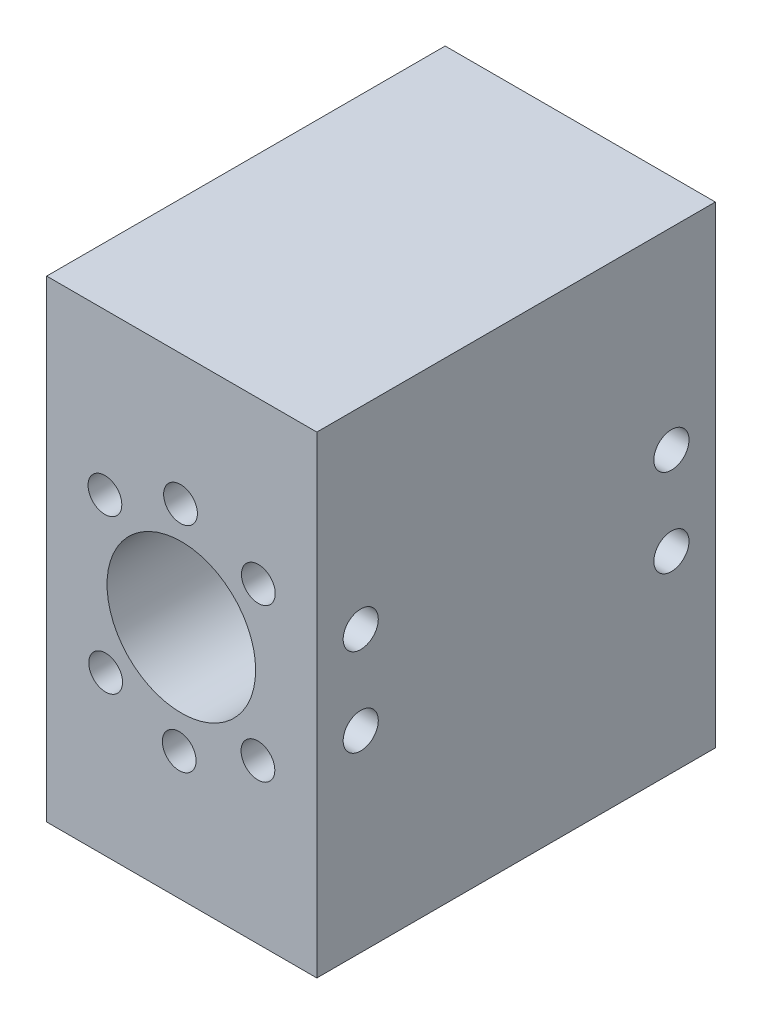
ISO-10303-21;
HEADER;
FILE_DESCRIPTION(('STEP AP214'),'2;1');
FILE_NAME('part.step','',(''),(''),'','','');
FILE_SCHEMA(('AUTOMOTIVE_DESIGN { 1 0 10303 214 1 1 1 1 }'));
ENDSEC;
DATA;
#1=APPLICATION_CONTEXT('core data for automotive mechanical design processes');
#2=APPLICATION_PROTOCOL_DEFINITION('international standard','automotive_design',2000,#1);
#3=PRODUCT_CONTEXT('',#1,'mechanical');
#4=PRODUCT('Part','Part','',(#3));
#5=PRODUCT_RELATED_PRODUCT_CATEGORY('part','',(#4));
#6=PRODUCT_DEFINITION_FORMATION('','',#4);
#7=PRODUCT_DEFINITION_CONTEXT('part definition',#1,'design');
#8=PRODUCT_DEFINITION('design','',#6,#7);
#9=PRODUCT_DEFINITION_SHAPE('','',#8);
#10=(LENGTH_UNIT() NAMED_UNIT(*) SI_UNIT(.MILLI.,.METRE.));
#11=(NAMED_UNIT(*) PLANE_ANGLE_UNIT() SI_UNIT($,.RADIAN.));
#12=(NAMED_UNIT(*) SI_UNIT($,.STERADIAN.) SOLID_ANGLE_UNIT());
#13=UNCERTAINTY_MEASURE_WITH_UNIT(LENGTH_MEASURE(1.E-05),#10,'distance_accuracy_value','');
#14=(GEOMETRIC_REPRESENTATION_CONTEXT(3) GLOBAL_UNCERTAINTY_ASSIGNED_CONTEXT((#13)) GLOBAL_UNIT_ASSIGNED_CONTEXT((#10,
#11,#12)) REPRESENTATION_CONTEXT('',''));
#15=CARTESIAN_POINT('',(0.,0.,0.));
#16=DIRECTION('',(0.,0.,1.));
#17=DIRECTION('',(1.,0.,0.));
#18=AXIS2_PLACEMENT_3D('',#15,#16,#17);
#19=CARTESIAN_POINT('',(-19.9391693437642,35.0627946480461,59.));
#20=DIRECTION('',(1.,0.,0.));
#21=DIRECTION('',(0.,0.,-1.));
#22=AXIS2_PLACEMENT_3D('',#19,#20,#21);
#23=PLANE('',#22);
#24=CARTESIAN_POINT('',(-19.9391693437642,0.0627946480460627,39.5));
#25=DIRECTION('',(-1.,0.,0.));
#26=DIRECTION('',(0.,0.,1.));
#27=AXIS2_PLACEMENT_3D('',#24,#25,#26);
#28=CIRCLE('',#27,2.49999999999999);
#29=CARTESIAN_POINT('',(-19.9391693437642,0.0627946480460627,42.));
#30=VERTEX_POINT('',#29);
#31=EDGE_CURVE('E144',#30,#30,#28,.T.);
#32=ORIENTED_EDGE('',*,*,#31,.F.);
#33=EDGE_LOOP('',(#32));
#34=FACE_BOUND('',#33,.T.);
#35=CARTESIAN_POINT('',(-19.9391693437642,0.0627946480460601,19.5));
#36=DIRECTION('',(-1.,0.,0.));
#37=DIRECTION('',(0.,0.,1.));
#38=AXIS2_PLACEMENT_3D('',#35,#36,#37);
#39=CIRCLE('',#38,2.49999999999999);
#40=CARTESIAN_POINT('',(-19.9391693437642,0.0627946480460601,22.));
#41=VERTEX_POINT('',#40);
#42=EDGE_CURVE('E151',#41,#41,#39,.T.);
#43=ORIENTED_EDGE('',*,*,#42,.F.);
#44=EDGE_LOOP('',(#43));
#45=FACE_BOUND('',#44,.T.);
#46=CARTESIAN_POINT('',(-19.9391693437642,10.0627946480461,29.5));
#47=DIRECTION('',(-1.,0.,0.));
#48=DIRECTION('',(0.,0.,1.));
#49=AXIS2_PLACEMENT_3D('',#46,#47,#48);
#50=CIRCLE('',#49,2.5);
#51=CARTESIAN_POINT('',(-19.9391693437642,10.0627946480461,32.));
#52=VERTEX_POINT('',#51);
#53=EDGE_CURVE('E132',#52,#52,#50,.T.);
#54=ORIENTED_EDGE('',*,*,#53,.F.);
#55=EDGE_LOOP('',(#54));
#56=FACE_BOUND('',#55,.T.);
#57=CARTESIAN_POINT('',(-19.9391693437642,-9.93720535195394,29.5));
#58=DIRECTION('',(-1.,0.,0.));
#59=DIRECTION('',(0.,0.,1.));
#60=AXIS2_PLACEMENT_3D('',#57,#58,#59);
#61=CIRCLE('',#60,2.5);
#62=CARTESIAN_POINT('',(-19.9391693437642,-9.93720535195394,32.));
#63=VERTEX_POINT('',#62);
#64=EDGE_CURVE('E139',#63,#63,#61,.T.);
#65=ORIENTED_EDGE('',*,*,#64,.F.);
#66=EDGE_LOOP('',(#65));
#67=FACE_BOUND('',#66,.T.);
#68=CARTESIAN_POINT('',(-19.9391693437642,0.0627946480460592,29.5));
#69=DIRECTION('',(-1.,0.,0.));
#70=DIRECTION('',(0.,0.,1.));
#71=AXIS2_PLACEMENT_3D('',#68,#69,#70);
#72=CIRCLE('',#71,2.49999999999999);
#73=CARTESIAN_POINT('',(-19.9391693437642,0.0627946480460592,32.));
#74=VERTEX_POINT('',#73);
#75=EDGE_CURVE('E147',#74,#74,#72,.T.);
#76=ORIENTED_EDGE('',*,*,#75,.F.);
#77=EDGE_LOOP('',(#76));
#78=FACE_BOUND('',#77,.T.);
#79=DIRECTION('',(0.,-1.,0.));
#80=VECTOR('',#79,1.);
#81=CARTESIAN_POINT('',(-19.9391693437642,35.0627946480461,0.));
#82=LINE('',#81,#80);
#83=CARTESIAN_POINT('',(-19.9391693437642,35.0627946480461,0.));
#84=VERTEX_POINT('',#83);
#85=CARTESIAN_POINT('',(-19.9391693437642,-34.937205351954,0.));
#86=VERTEX_POINT('',#85);
#87=EDGE_CURVE('E201',#84,#86,#82,.T.);
#88=ORIENTED_EDGE('',*,*,#87,.T.);
#89=DIRECTION('',(0.,0.,-1.));
#90=VECTOR('',#89,1.);
#91=CARTESIAN_POINT('',(-19.9391693437642,-34.937205351954,59.));
#92=LINE('',#91,#90);
#93=CARTESIAN_POINT('',(-19.9391693437642,-34.937205351954,59.));
#94=VERTEX_POINT('',#93);
#95=EDGE_CURVE('E11',#94,#86,#92,.T.);
#96=ORIENTED_EDGE('',*,*,#95,.F.);
#97=DIRECTION('',(0.,-1.,0.));
#98=VECTOR('',#97,1.);
#99=CARTESIAN_POINT('',(-19.9391693437642,35.0627946480461,59.));
#100=LINE('',#99,#98);
#101=CARTESIAN_POINT('',(-19.9391693437642,35.0627946480461,59.));
#102=VERTEX_POINT('',#101);
#103=EDGE_CURVE('E204',#102,#94,#100,.T.);
#104=ORIENTED_EDGE('',*,*,#103,.F.);
#105=DIRECTION('',(0.,0.,-1.));
#106=VECTOR('',#105,1.);
#107=CARTESIAN_POINT('',(-19.9391693437642,35.0627946480461,59.));
#108=LINE('',#107,#106);
#109=EDGE_CURVE('E58',#102,#84,#108,.T.);
#110=ORIENTED_EDGE('',*,*,#109,.T.);
#111=EDGE_LOOP('',(#88,#96,#104,#110));
#112=FACE_BOUND('',#111,.T.);
#113=ADVANCED_FACE('F42',(#34,#45,#56,#67,#78,#112),#23,.F.);
#114=CARTESIAN_POINT('',(-19.9391693437642,-34.937205351954,59.));
#115=DIRECTION('',(0.,1.,0.));
#116=DIRECTION('',(0.,0.,1.));
#117=AXIS2_PLACEMENT_3D('',#114,#115,#116);
#118=PLANE('',#117);
#119=DIRECTION('',(1.,0.,0.));
#120=VECTOR('',#119,1.);
#121=CARTESIAN_POINT('',(-19.9391693437642,-34.937205351954,0.));
#122=LINE('',#121,#120);
#123=CARTESIAN_POINT('',(20.0608306562358,-34.937205351954,0.));
#124=VERTEX_POINT('',#123);
#125=EDGE_CURVE('E214',#86,#124,#122,.T.);
#126=ORIENTED_EDGE('',*,*,#125,.T.);
#127=DIRECTION('',(0.,0.,-1.));
#128=VECTOR('',#127,1.);
#129=CARTESIAN_POINT('',(20.0608306562358,-34.937205351954,59.));
#130=LINE('',#129,#128);
#131=CARTESIAN_POINT('',(20.0608306562358,-34.937205351954,59.));
#132=VERTEX_POINT('',#131);
#133=EDGE_CURVE('E50',#132,#124,#130,.T.);
#134=ORIENTED_EDGE('',*,*,#133,.F.);
#135=DIRECTION('',(1.,0.,0.));
#136=VECTOR('',#135,1.);
#137=CARTESIAN_POINT('',(-19.9391693437642,-34.937205351954,59.));
#138=LINE('',#137,#136);
#139=EDGE_CURVE('E84',#94,#132,#138,.T.);
#140=ORIENTED_EDGE('',*,*,#139,.F.);
#141=ORIENTED_EDGE('',*,*,#95,.T.);
#142=EDGE_LOOP('',(#126,#134,#140,#141));
#143=FACE_BOUND('',#142,.T.);
#144=ADVANCED_FACE('F226',(#143),#118,.F.);
#145=CARTESIAN_POINT('',(20.0608306562358,35.0627946480461,59.));
#146=DIRECTION('',(1.,0.,0.));
#147=DIRECTION('',(0.,0.,-1.));
#148=AXIS2_PLACEMENT_3D('',#145,#146,#147);
#149=PLANE('',#148);
#150=CARTESIAN_POINT('',(20.0608306562358,6.53001711896831,52.5006337334076));
#151=DIRECTION('',(1.,0.,0.));
#152=DIRECTION('',(0.,0.,-1.));
#153=AXIS2_PLACEMENT_3D('',#150,#151,#152);
#154=CIRCLE('',#153,2.59999999999999);
#155=CARTESIAN_POINT('',(20.0608306562358,6.53001711896831,49.9006337334076));
#156=VERTEX_POINT('',#155);
#157=EDGE_CURVE('E109',#156,#156,#154,.T.);
#158=ORIENTED_EDGE('',*,*,#157,.F.);
#159=EDGE_LOOP('',(#158));
#160=FACE_BOUND('',#159,.T.);
#161=CARTESIAN_POINT('',(20.0608306562358,-6.46998288103168,52.5006337334076));
#162=DIRECTION('',(1.,0.,0.));
#163=DIRECTION('',(0.,0.,-1.));
#164=AXIS2_PLACEMENT_3D('',#161,#162,#163);
#165=CIRCLE('',#164,2.59999999999999);
#166=CARTESIAN_POINT('',(20.0608306562358,-6.46998288103168,49.9006337334076));
#167=VERTEX_POINT('',#166);
#168=EDGE_CURVE('E108',#167,#167,#165,.T.);
#169=ORIENTED_EDGE('',*,*,#168,.F.);
#170=EDGE_LOOP('',(#169));
#171=FACE_BOUND('',#170,.T.);
#172=CARTESIAN_POINT('',(20.0608306562358,-6.46998288103168,6.50063373340761));
#173=DIRECTION('',(1.,0.,0.));
#174=DIRECTION('',(0.,0.,-1.));
#175=AXIS2_PLACEMENT_3D('',#172,#173,#174);
#176=CIRCLE('',#175,2.59999999999999);
#177=CARTESIAN_POINT('',(20.0608306562358,-6.46998288103168,3.90063373340762));
#178=VERTEX_POINT('',#177);
#179=EDGE_CURVE('E119',#178,#178,#176,.T.);
#180=ORIENTED_EDGE('',*,*,#179,.F.);
#181=EDGE_LOOP('',(#180));
#182=FACE_BOUND('',#181,.T.);
#183=CARTESIAN_POINT('',(20.0608306562358,6.53001711896831,6.50063373340761));
#184=DIRECTION('',(1.,0.,0.));
#185=DIRECTION('',(0.,0.,-1.));
#186=AXIS2_PLACEMENT_3D('',#183,#184,#185);
#187=CIRCLE('',#186,2.59999999999999);
#188=CARTESIAN_POINT('',(20.0608306562358,6.53001711896831,3.90063373340762));
#189=VERTEX_POINT('',#188);
#190=EDGE_CURVE('E125',#189,#189,#187,.T.);
#191=ORIENTED_EDGE('',*,*,#190,.F.);
#192=EDGE_LOOP('',(#191));
#193=FACE_BOUND('',#192,.T.);
#194=DIRECTION('',(0.,-1.,0.));
#195=VECTOR('',#194,1.);
#196=CARTESIAN_POINT('',(20.0608306562358,35.0627946480461,0.));
#197=LINE('',#196,#195);
#198=CARTESIAN_POINT('',(20.0608306562358,35.0627946480461,0.));
#199=VERTEX_POINT('',#198);
#200=EDGE_CURVE('E217',#199,#124,#197,.T.);
#201=ORIENTED_EDGE('',*,*,#200,.F.);
#202=DIRECTION('',(0.,0.,-1.));
#203=VECTOR('',#202,1.);
#204=CARTESIAN_POINT('',(20.0608306562358,35.0627946480461,59.));
#205=LINE('',#204,#203);
#206=CARTESIAN_POINT('',(20.0608306562358,35.0627946480461,59.));
#207=VERTEX_POINT('',#206);
#208=EDGE_CURVE('E73',#207,#199,#205,.T.);
#209=ORIENTED_EDGE('',*,*,#208,.F.);
#210=DIRECTION('',(0.,-1.,0.));
#211=VECTOR('',#210,1.);
#212=CARTESIAN_POINT('',(20.0608306562358,35.0627946480461,59.));
#213=LINE('',#212,#211);
#214=EDGE_CURVE('E208',#207,#132,#213,.T.);
#215=ORIENTED_EDGE('',*,*,#214,.T.);
#216=ORIENTED_EDGE('',*,*,#133,.T.);
#217=EDGE_LOOP('',(#201,#209,#215,#216));
#218=FACE_BOUND('',#217,.T.);
#219=ADVANCED_FACE('F224',(#160,#171,#182,#193,#218),#149,.T.);
#220=CARTESIAN_POINT('',(-19.9391693437642,35.0627946480461,59.));
#221=DIRECTION('',(0.,1.,0.));
#222=DIRECTION('',(0.,0.,1.));
#223=AXIS2_PLACEMENT_3D('',#220,#221,#222);
#224=PLANE('',#223);
#225=DIRECTION('',(1.,0.,0.));
#226=VECTOR('',#225,1.);
#227=CARTESIAN_POINT('',(-19.9391693437642,35.0627946480461,0.));
#228=LINE('',#227,#226);
#229=EDGE_CURVE('E206',#84,#199,#228,.T.);
#230=ORIENTED_EDGE('',*,*,#229,.F.);
#231=ORIENTED_EDGE('',*,*,#109,.F.);
#232=DIRECTION('',(1.,0.,0.));
#233=VECTOR('',#232,1.);
#234=CARTESIAN_POINT('',(-19.9391693437642,35.0627946480461,59.));
#235=LINE('',#234,#233);
#236=EDGE_CURVE('E211',#102,#207,#235,.T.);
#237=ORIENTED_EDGE('',*,*,#236,.T.);
#238=ORIENTED_EDGE('',*,*,#208,.T.);
#239=EDGE_LOOP('',(#230,#231,#237,#238));
#240=FACE_BOUND('',#239,.T.);
#241=ADVANCED_FACE('F230',(#240),#224,.T.);
#242=CARTESIAN_POINT('',(0.,0.,59.));
#243=DIRECTION('',(0.,0.,1.));
#244=DIRECTION('',(1.,0.,0.));
#245=AXIS2_PLACEMENT_3D('',#242,#243,#244);
#246=PLANE('',#245);
#247=CARTESIAN_POINT('',(-11.3137084989847,11.3137084989848,59.));
#248=DIRECTION('',(0.,0.,1.));
#249=DIRECTION('',(1.,0.,0.));
#250=AXIS2_PLACEMENT_3D('',#247,#248,#249);
#251=CIRCLE('',#250,2.5);
#252=CARTESIAN_POINT('',(-8.8137084989847,11.3137084989848,59.));
#253=VERTEX_POINT('',#252);
#254=EDGE_CURVE('E178',#253,#253,#251,.T.);
#255=ORIENTED_EDGE('',*,*,#254,.F.);
#256=EDGE_LOOP('',(#255));
#257=FACE_BOUND('',#256,.T.);
#258=CARTESIAN_POINT('',(-0.122338903727766,15.7597255865445,59.));
#259=DIRECTION('',(0.,0.,1.));
#260=DIRECTION('',(1.,0.,0.));
#261=AXIS2_PLACEMENT_3D('',#258,#259,#260);
#262=CIRCLE('',#261,2.5);
#263=CARTESIAN_POINT('',(2.37766109627223,15.7597255865445,59.));
#264=VERTEX_POINT('',#263);
#265=EDGE_CURVE('E184',#264,#264,#262,.T.);
#266=ORIENTED_EDGE('',*,*,#265,.F.);
#267=EDGE_LOOP('',(#266));
#268=FACE_BOUND('',#267,.T.);
#269=CARTESIAN_POINT('',(11.4026934424135,11.2636964844784,59.));
#270=DIRECTION('',(0.,0.,1.));
#271=DIRECTION('',(1.,0.,0.));
#272=AXIS2_PLACEMENT_3D('',#269,#270,#271);
#273=CIRCLE('',#272,2.5);
#274=CARTESIAN_POINT('',(13.9026934424135,11.2636964844784,59.));
#275=VERTEX_POINT('',#274);
#276=EDGE_CURVE('E190',#275,#275,#273,.T.);
#277=ORIENTED_EDGE('',*,*,#276,.F.);
#278=EDGE_LOOP('',(#277));
#279=FACE_BOUND('',#278,.T.);
#280=CARTESIAN_POINT('',(11.3393690888633,-11.4064220865028,59.));
#281=DIRECTION('',(0.,0.,1.));
#282=DIRECTION('',(1.,0.,0.));
#283=AXIS2_PLACEMENT_3D('',#280,#281,#282);
#284=CIRCLE('',#283,2.5);
#285=CARTESIAN_POINT('',(13.8393690888633,-11.4064220865028,59.));
#286=VERTEX_POINT('',#285);
#287=EDGE_CURVE('E165',#286,#286,#284,.T.);
#288=ORIENTED_EDGE('',*,*,#287,.F.);
#289=EDGE_LOOP('',(#288));
#290=FACE_BOUND('',#289,.T.);
#291=CARTESIAN_POINT('',(-0.312311964378448,-16.0290998956694,59.));
#292=DIRECTION('',(0.,0.,1.));
#293=DIRECTION('',(1.,0.,0.));
#294=AXIS2_PLACEMENT_3D('',#291,#292,#293);
#295=CIRCLE('',#294,2.5);
#296=CARTESIAN_POINT('',(2.18768803562155,-16.0290998956694,59.));
#297=VERTEX_POINT('',#296);
#298=EDGE_CURVE('E166',#297,#297,#295,.T.);
#299=ORIENTED_EDGE('',*,*,#298,.F.);
#300=EDGE_LOOP('',(#299));
#301=FACE_BOUND('',#300,.T.);
#302=CARTESIAN_POINT('',(-11.2041007750175,-11.4064220865028,59.));
#303=DIRECTION('',(0.,0.,1.));
#304=DIRECTION('',(1.,0.,0.));
#305=AXIS2_PLACEMENT_3D('',#302,#303,#304);
#306=CIRCLE('',#305,2.5);
#307=CARTESIAN_POINT('',(-8.70410077501747,-11.4064220865028,59.));
#308=VERTEX_POINT('',#307);
#309=EDGE_CURVE('E159',#308,#308,#306,.T.);
#310=ORIENTED_EDGE('',*,*,#309,.F.);
#311=EDGE_LOOP('',(#310));
#312=FACE_BOUND('',#311,.T.);
#313=CARTESIAN_POINT('',(0.,0.,59.));
#314=DIRECTION('',(0.,0.,1.));
#315=DIRECTION('',(1.,0.,0.));
#316=AXIS2_PLACEMENT_3D('',#313,#314,#315);
#317=CIRCLE('',#316,11.);
#318=CARTESIAN_POINT('',(11.,0.,59.));
#319=VERTEX_POINT('',#318);
#320=EDGE_CURVE('E198',#319,#319,#317,.T.);
#321=ORIENTED_EDGE('',*,*,#320,.F.);
#322=EDGE_LOOP('',(#321));
#323=FACE_BOUND('',#322,.T.);
#324=ORIENTED_EDGE('',*,*,#103,.T.);
#325=ORIENTED_EDGE('',*,*,#139,.T.);
#326=ORIENTED_EDGE('',*,*,#214,.F.);
#327=ORIENTED_EDGE('',*,*,#236,.F.);
#328=EDGE_LOOP('',(#324,#325,#326,#327));
#329=FACE_BOUND('',#328,.T.);
#330=ADVANCED_FACE('F232',(#257,#268,#279,#290,#301,#312,#323,#329),#246,.T.);
#331=CARTESIAN_POINT('',(0.,0.,0.));
#332=DIRECTION('',(0.,0.,1.));
#333=DIRECTION('',(1.,0.,0.));
#334=AXIS2_PLACEMENT_3D('',#331,#332,#333);
#335=PLANE('',#334);
#336=CARTESIAN_POINT('',(-11.3137084989847,11.3137084989848,0.));
#337=DIRECTION('',(0.,0.,1.));
#338=DIRECTION('',(1.,0.,0.));
#339=AXIS2_PLACEMENT_3D('',#336,#337,#338);
#340=CIRCLE('',#339,2.5);
#341=CARTESIAN_POINT('',(-8.8137084989847,11.3137084989848,0.));
#342=VERTEX_POINT('',#341);
#343=EDGE_CURVE('E174',#342,#342,#340,.T.);
#344=ORIENTED_EDGE('',*,*,#343,.T.);
#345=EDGE_LOOP('',(#344));
#346=FACE_BOUND('',#345,.T.);
#347=CARTESIAN_POINT('',(-0.122338903727766,15.7597255865445,0.));
#348=DIRECTION('',(0.,0.,1.));
#349=DIRECTION('',(1.,0.,0.));
#350=AXIS2_PLACEMENT_3D('',#347,#348,#349);
#351=CIRCLE('',#350,2.5);
#352=CARTESIAN_POINT('',(2.37766109627223,15.7597255865445,0.));
#353=VERTEX_POINT('',#352);
#354=EDGE_CURVE('E181',#353,#353,#351,.T.);
#355=ORIENTED_EDGE('',*,*,#354,.T.);
#356=EDGE_LOOP('',(#355));
#357=FACE_BOUND('',#356,.T.);
#358=CARTESIAN_POINT('',(11.4026934424135,11.2636964844784,0.));
#359=DIRECTION('',(0.,0.,1.));
#360=DIRECTION('',(1.,0.,0.));
#361=AXIS2_PLACEMENT_3D('',#358,#359,#360);
#362=CIRCLE('',#361,2.5);
#363=CARTESIAN_POINT('',(13.9026934424135,11.2636964844784,0.));
#364=VERTEX_POINT('',#363);
#365=EDGE_CURVE('E187',#364,#364,#362,.T.);
#366=ORIENTED_EDGE('',*,*,#365,.T.);
#367=EDGE_LOOP('',(#366));
#368=FACE_BOUND('',#367,.T.);
#369=CARTESIAN_POINT('',(11.3393690888633,-11.4064220865028,0.));
#370=DIRECTION('',(0.,0.,1.));
#371=DIRECTION('',(1.,0.,0.));
#372=AXIS2_PLACEMENT_3D('',#369,#370,#371);
#373=CIRCLE('',#372,2.5);
#374=CARTESIAN_POINT('',(13.8393690888633,-11.4064220865028,0.));
#375=VERTEX_POINT('',#374);
#376=EDGE_CURVE('E193',#375,#375,#373,.T.);
#377=ORIENTED_EDGE('',*,*,#376,.T.);
#378=EDGE_LOOP('',(#377));
#379=FACE_BOUND('',#378,.T.);
#380=CARTESIAN_POINT('',(-0.312311964378448,-16.0290998956694,0.));
#381=DIRECTION('',(0.,0.,1.));
#382=DIRECTION('',(1.,0.,0.));
#383=AXIS2_PLACEMENT_3D('',#380,#381,#382);
#384=CIRCLE('',#383,2.5);
#385=CARTESIAN_POINT('',(2.18768803562155,-16.0290998956694,0.));
#386=VERTEX_POINT('',#385);
#387=EDGE_CURVE('E162',#386,#386,#384,.T.);
#388=ORIENTED_EDGE('',*,*,#387,.T.);
#389=EDGE_LOOP('',(#388));
#390=FACE_BOUND('',#389,.T.);
#391=CARTESIAN_POINT('',(-11.2041007750175,-11.4064220865028,0.));
#392=DIRECTION('',(0.,0.,1.));
#393=DIRECTION('',(1.,0.,0.));
#394=AXIS2_PLACEMENT_3D('',#391,#392,#393);
#395=CIRCLE('',#394,2.5);
#396=CARTESIAN_POINT('',(-8.70410077501747,-11.4064220865028,0.));
#397=VERTEX_POINT('',#396);
#398=EDGE_CURVE('E169',#397,#397,#395,.T.);
#399=ORIENTED_EDGE('',*,*,#398,.T.);
#400=EDGE_LOOP('',(#399));
#401=FACE_BOUND('',#400,.T.);
#402=CARTESIAN_POINT('',(0.,0.,0.));
#403=DIRECTION('',(0.,0.,1.));
#404=DIRECTION('',(1.,0.,0.));
#405=AXIS2_PLACEMENT_3D('',#402,#403,#404);
#406=CIRCLE('',#405,11.);
#407=CARTESIAN_POINT('',(11.,0.,0.));
#408=VERTEX_POINT('',#407);
#409=EDGE_CURVE('E177',#408,#408,#406,.T.);
#410=ORIENTED_EDGE('',*,*,#409,.T.);
#411=EDGE_LOOP('',(#410));
#412=FACE_BOUND('',#411,.T.);
#413=ORIENTED_EDGE('',*,*,#87,.F.);
#414=ORIENTED_EDGE('',*,*,#229,.T.);
#415=ORIENTED_EDGE('',*,*,#200,.T.);
#416=ORIENTED_EDGE('',*,*,#125,.F.);
#417=EDGE_LOOP('',(#413,#414,#415,#416));
#418=FACE_BOUND('',#417,.T.);
#419=ADVANCED_FACE('F229',(#346,#357,#368,#379,#390,#401,#412,#418),#335,.F.);
#420=CARTESIAN_POINT('',(0.,0.,59.));
#421=DIRECTION('',(0.,0.,-1.));
#422=DIRECTION('',(-1.,0.,0.));
#423=AXIS2_PLACEMENT_3D('',#420,#421,#422);
#424=CYLINDRICAL_SURFACE('',#423,11.);
#425=ORIENTED_EDGE('',*,*,#320,.T.);
#426=EDGE_LOOP('',(#425));
#427=FACE_BOUND('',#426,.T.);
#428=ORIENTED_EDGE('',*,*,#409,.F.);
#429=EDGE_LOOP('',(#428));
#430=FACE_BOUND('',#429,.T.);
#431=ADVANCED_FACE('F286',(#427,#430),#424,.F.);
#432=CARTESIAN_POINT('',(-11.2041007750175,-11.4064220865028,59.));
#433=DIRECTION('',(0.,0.,-1.));
#434=DIRECTION('',(-1.,0.,0.));
#435=AXIS2_PLACEMENT_3D('',#432,#433,#434);
#436=CYLINDRICAL_SURFACE('',#435,2.5);
#437=ORIENTED_EDGE('',*,*,#309,.T.);
#438=EDGE_LOOP('',(#437));
#439=FACE_BOUND('',#438,.T.);
#440=ORIENTED_EDGE('',*,*,#398,.F.);
#441=EDGE_LOOP('',(#440));
#442=FACE_BOUND('',#441,.T.);
#443=ADVANCED_FACE('F283',(#439,#442),#436,.F.);
#444=CARTESIAN_POINT('',(-0.312311964378448,-16.0290998956694,59.));
#445=DIRECTION('',(0.,0.,-1.));
#446=DIRECTION('',(-1.,0.,0.));
#447=AXIS2_PLACEMENT_3D('',#444,#445,#446);
#448=CYLINDRICAL_SURFACE('',#447,2.5);
#449=ORIENTED_EDGE('',*,*,#298,.T.);
#450=EDGE_LOOP('',(#449));
#451=FACE_BOUND('',#450,.T.);
#452=ORIENTED_EDGE('',*,*,#387,.F.);
#453=EDGE_LOOP('',(#452));
#454=FACE_BOUND('',#453,.T.);
#455=ADVANCED_FACE('F279',(#451,#454),#448,.F.);
#456=CARTESIAN_POINT('',(11.3393690888633,-11.4064220865028,59.));
#457=DIRECTION('',(0.,0.,-1.));
#458=DIRECTION('',(-1.,0.,0.));
#459=AXIS2_PLACEMENT_3D('',#456,#457,#458);
#460=CYLINDRICAL_SURFACE('',#459,2.5);
#461=ORIENTED_EDGE('',*,*,#287,.T.);
#462=EDGE_LOOP('',(#461));
#463=FACE_BOUND('',#462,.T.);
#464=ORIENTED_EDGE('',*,*,#376,.F.);
#465=EDGE_LOOP('',(#464));
#466=FACE_BOUND('',#465,.T.);
#467=ADVANCED_FACE('F282',(#463,#466),#460,.F.);
#468=CARTESIAN_POINT('',(11.4026934424135,11.2636964844784,59.));
#469=DIRECTION('',(0.,0.,-1.));
#470=DIRECTION('',(-1.,0.,0.));
#471=AXIS2_PLACEMENT_3D('',#468,#469,#470);
#472=CYLINDRICAL_SURFACE('',#471,2.5);
#473=ORIENTED_EDGE('',*,*,#276,.T.);
#474=EDGE_LOOP('',(#473));
#475=FACE_BOUND('',#474,.T.);
#476=ORIENTED_EDGE('',*,*,#365,.F.);
#477=EDGE_LOOP('',(#476));
#478=FACE_BOUND('',#477,.T.);
#479=ADVANCED_FACE('F291',(#475,#478),#472,.F.);
#480=CARTESIAN_POINT('',(-0.122338903727766,15.7597255865445,59.));
#481=DIRECTION('',(0.,0.,-1.));
#482=DIRECTION('',(-1.,0.,0.));
#483=AXIS2_PLACEMENT_3D('',#480,#481,#482);
#484=CYLINDRICAL_SURFACE('',#483,2.5);
#485=ORIENTED_EDGE('',*,*,#265,.T.);
#486=EDGE_LOOP('',(#485));
#487=FACE_BOUND('',#486,.T.);
#488=ORIENTED_EDGE('',*,*,#354,.F.);
#489=EDGE_LOOP('',(#488));
#490=FACE_BOUND('',#489,.T.);
#491=ADVANCED_FACE('F273',(#487,#490),#484,.F.);
#492=CARTESIAN_POINT('',(-11.3137084989847,11.3137084989848,59.));
#493=DIRECTION('',(0.,0.,-1.));
#494=DIRECTION('',(-1.,0.,0.));
#495=AXIS2_PLACEMENT_3D('',#492,#493,#494);
#496=CYLINDRICAL_SURFACE('',#495,2.5);
#497=ORIENTED_EDGE('',*,*,#254,.T.);
#498=EDGE_LOOP('',(#497));
#499=FACE_BOUND('',#498,.T.);
#500=ORIENTED_EDGE('',*,*,#343,.F.);
#501=EDGE_LOOP('',(#500));
#502=FACE_BOUND('',#501,.T.);
#503=ADVANCED_FACE('F263',(#499,#502),#496,.F.);
#504=CARTESIAN_POINT('',(-14.9391693437642,0.0627946480460592,29.5));
#505=DIRECTION('',(-1.,0.,0.));
#506=DIRECTION('',(0.,0.,1.));
#507=AXIS2_PLACEMENT_3D('',#504,#505,#506);
#508=CYLINDRICAL_SURFACE('',#507,2.49999999999999);
#509=CARTESIAN_POINT('',(-14.9391693437642,0.0627946480460592,29.5));
#510=DIRECTION('',(-1.,0.,0.));
#511=DIRECTION('',(0.,0.,1.));
#512=AXIS2_PLACEMENT_3D('',#509,#510,#511);
#513=CIRCLE('',#512,2.49999999999999);
#514=CARTESIAN_POINT('',(-14.9391693437642,0.0627946480460592,32.));
#515=VERTEX_POINT('',#514);
#516=EDGE_CURVE('E156',#515,#515,#513,.T.);
#517=ORIENTED_EDGE('',*,*,#516,.F.);
#518=EDGE_LOOP('',(#517));
#519=FACE_BOUND('',#518,.T.);
#520=ORIENTED_EDGE('',*,*,#75,.T.);
#521=EDGE_LOOP('',(#520));
#522=FACE_BOUND('',#521,.T.);
#523=ADVANCED_FACE('F260',(#519,#522),#508,.F.);
#524=CARTESIAN_POINT('',(-14.9391693437642,0.0627946480460592,29.5));
#525=DIRECTION('',(-1.,0.,0.));
#526=DIRECTION('',(0.,0.,1.));
#527=AXIS2_PLACEMENT_3D('',#524,#525,#526);
#528=PLANE('',#527);
#529=ORIENTED_EDGE('',*,*,#516,.T.);
#530=EDGE_LOOP('',(#529));
#531=FACE_BOUND('',#530,.T.);
#532=ADVANCED_FACE('F262',(#531),#528,.T.);
#533=CARTESIAN_POINT('',(-14.9391693437642,-9.93720535195394,29.5));
#534=DIRECTION('',(-1.,0.,0.));
#535=DIRECTION('',(0.,0.,1.));
#536=AXIS2_PLACEMENT_3D('',#533,#534,#535);
#537=CYLINDRICAL_SURFACE('',#536,2.5);
#538=CARTESIAN_POINT('',(-14.9391693437642,-9.93720535195394,29.5));
#539=DIRECTION('',(-1.,0.,0.));
#540=DIRECTION('',(0.,0.,1.));
#541=AXIS2_PLACEMENT_3D('',#538,#539,#540);
#542=CIRCLE('',#541,2.5);
#543=CARTESIAN_POINT('',(-14.9391693437642,-9.93720535195394,32.));
#544=VERTEX_POINT('',#543);
#545=EDGE_CURVE('E131',#544,#544,#542,.T.);
#546=ORIENTED_EDGE('',*,*,#545,.F.);
#547=EDGE_LOOP('',(#546));
#548=FACE_BOUND('',#547,.T.);
#549=ORIENTED_EDGE('',*,*,#64,.T.);
#550=EDGE_LOOP('',(#549));
#551=FACE_BOUND('',#550,.T.);
#552=ADVANCED_FACE('F270',(#548,#551),#537,.F.);
#553=CARTESIAN_POINT('',(-14.9391693437642,-9.93720535195394,29.5));
#554=DIRECTION('',(-1.,0.,0.));
#555=DIRECTION('',(0.,0.,1.));
#556=AXIS2_PLACEMENT_3D('',#553,#554,#555);
#557=PLANE('',#556);
#558=ORIENTED_EDGE('',*,*,#545,.T.);
#559=EDGE_LOOP('',(#558));
#560=FACE_BOUND('',#559,.T.);
#561=ADVANCED_FACE('F383',(#560),#557,.T.);
#562=CARTESIAN_POINT('',(-14.9391693437642,10.0627946480461,29.5));
#563=DIRECTION('',(-1.,0.,0.));
#564=DIRECTION('',(0.,0.,1.));
#565=AXIS2_PLACEMENT_3D('',#562,#563,#564);
#566=CYLINDRICAL_SURFACE('',#565,2.5);
#567=CARTESIAN_POINT('',(-14.9391693437642,10.0627946480461,29.5));
#568=DIRECTION('',(-1.,0.,0.));
#569=DIRECTION('',(0.,0.,1.));
#570=AXIS2_PLACEMENT_3D('',#567,#568,#569);
#571=CIRCLE('',#570,2.5);
#572=CARTESIAN_POINT('',(-14.9391693437642,10.0627946480461,32.));
#573=VERTEX_POINT('',#572);
#574=EDGE_CURVE('E136',#573,#573,#571,.T.);
#575=ORIENTED_EDGE('',*,*,#574,.F.);
#576=EDGE_LOOP('',(#575));
#577=FACE_BOUND('',#576,.T.);
#578=ORIENTED_EDGE('',*,*,#53,.T.);
#579=EDGE_LOOP('',(#578));
#580=FACE_BOUND('',#579,.T.);
#581=ADVANCED_FACE('F394',(#577,#580),#566,.F.);
#582=CARTESIAN_POINT('',(-14.9391693437642,10.0627946480461,29.5));
#583=DIRECTION('',(-1.,0.,0.));
#584=DIRECTION('',(0.,0.,1.));
#585=AXIS2_PLACEMENT_3D('',#582,#583,#584);
#586=PLANE('',#585);
#587=ORIENTED_EDGE('',*,*,#574,.T.);
#588=EDGE_LOOP('',(#587));
#589=FACE_BOUND('',#588,.T.);
#590=ADVANCED_FACE('F405',(#589),#586,.T.);
#591=CARTESIAN_POINT('',(-14.9391693437642,0.0627946480460601,19.5));
#592=DIRECTION('',(-1.,0.,0.));
#593=DIRECTION('',(0.,0.,1.));
#594=AXIS2_PLACEMENT_3D('',#591,#592,#593);
#595=CYLINDRICAL_SURFACE('',#594,2.49999999999999);
#596=CARTESIAN_POINT('',(-14.9391693437642,0.0627946480460601,19.5));
#597=DIRECTION('',(-1.,0.,0.));
#598=DIRECTION('',(0.,0.,1.));
#599=AXIS2_PLACEMENT_3D('',#596,#597,#598);
#600=CIRCLE('',#599,2.49999999999999);
#601=CARTESIAN_POINT('',(-14.9391693437642,0.0627946480460601,22.));
#602=VERTEX_POINT('',#601);
#603=EDGE_CURVE('E135',#602,#602,#600,.T.);
#604=ORIENTED_EDGE('',*,*,#603,.F.);
#605=EDGE_LOOP('',(#604));
#606=FACE_BOUND('',#605,.T.);
#607=ORIENTED_EDGE('',*,*,#42,.T.);
#608=EDGE_LOOP('',(#607));
#609=FACE_BOUND('',#608,.T.);
#610=ADVANCED_FACE('F416',(#606,#609),#595,.F.);
#611=CARTESIAN_POINT('',(-14.9391693437642,0.0627946480460601,19.5));
#612=DIRECTION('',(-1.,0.,0.));
#613=DIRECTION('',(0.,0.,1.));
#614=AXIS2_PLACEMENT_3D('',#611,#612,#613);
#615=PLANE('',#614);
#616=ORIENTED_EDGE('',*,*,#603,.T.);
#617=EDGE_LOOP('',(#616));
#618=FACE_BOUND('',#617,.T.);
#619=ADVANCED_FACE('F427',(#618),#615,.T.);
#620=CARTESIAN_POINT('',(-14.9391693437642,0.0627946480460627,39.5));
#621=DIRECTION('',(-1.,0.,0.));
#622=DIRECTION('',(0.,0.,1.));
#623=AXIS2_PLACEMENT_3D('',#620,#621,#622);
#624=CYLINDRICAL_SURFACE('',#623,2.49999999999999);
#625=CARTESIAN_POINT('',(-14.9391693437642,0.0627946480460627,39.5));
#626=DIRECTION('',(-1.,0.,0.));
#627=DIRECTION('',(0.,0.,1.));
#628=AXIS2_PLACEMENT_3D('',#625,#626,#627);
#629=CIRCLE('',#628,2.49999999999999);
#630=CARTESIAN_POINT('',(-14.9391693437642,0.0627946480460627,42.));
#631=VERTEX_POINT('',#630);
#632=EDGE_CURVE('E148',#631,#631,#629,.T.);
#633=ORIENTED_EDGE('',*,*,#632,.F.);
#634=EDGE_LOOP('',(#633));
#635=FACE_BOUND('',#634,.T.);
#636=ORIENTED_EDGE('',*,*,#31,.T.);
#637=EDGE_LOOP('',(#636));
#638=FACE_BOUND('',#637,.T.);
#639=ADVANCED_FACE('F438',(#635,#638),#624,.F.);
#640=CARTESIAN_POINT('',(-14.9391693437642,0.0627946480460627,39.5));
#641=DIRECTION('',(-1.,0.,0.));
#642=DIRECTION('',(0.,0.,1.));
#643=AXIS2_PLACEMENT_3D('',#640,#641,#642);
#644=PLANE('',#643);
#645=ORIENTED_EDGE('',*,*,#632,.T.);
#646=EDGE_LOOP('',(#645));
#647=FACE_BOUND('',#646,.T.);
#648=ADVANCED_FACE('F448',(#647),#644,.T.);
#649=CARTESIAN_POINT('',(13.6230682657075,6.53001711896831,6.50063373340761));
#650=DIRECTION('',(1.,0.,0.));
#651=DIRECTION('',(0.,0.,-1.));
#652=AXIS2_PLACEMENT_3D('',#649,#650,#651);
#653=CONICAL_SURFACE('',#652,2.6,1.02974425867665);
#654=CARTESIAN_POINT('',(12.0608306562358,6.53001711896831,6.50063373340761));
#655=VERTEX_POINT('',#654);
#656=VERTEX_LOOP('',#655);
#657=FACE_BOUND('',#656,.T.);
#658=CARTESIAN_POINT('',(13.6230682657075,6.53001711896831,6.50063373340761));
#659=DIRECTION('',(1.,0.,0.));
#660=DIRECTION('',(0.,0.,-1.));
#661=AXIS2_PLACEMENT_3D('',#658,#659,#660);
#662=CIRCLE('',#661,2.6);
#663=CARTESIAN_POINT('',(13.6230682657075,6.53001711896831,3.90063373340761));
#664=VERTEX_POINT('',#663);
#665=EDGE_CURVE('E128',#664,#664,#662,.T.);
#666=ORIENTED_EDGE('',*,*,#665,.T.);
#667=EDGE_LOOP('',(#666));
#668=FACE_BOUND('',#667,.T.);
#669=ADVANCED_FACE('F459',(#657,#668),#653,.F.);
#670=CARTESIAN_POINT('',(20.0608306562358,6.53001711896831,6.50063373340761));
#671=DIRECTION('',(1.,0.,0.));
#672=DIRECTION('',(0.,0.,-1.));
#673=AXIS2_PLACEMENT_3D('',#670,#671,#672);
#674=CYLINDRICAL_SURFACE('',#673,2.59999999999999);
#675=ORIENTED_EDGE('',*,*,#665,.F.);
#676=EDGE_LOOP('',(#675));
#677=FACE_BOUND('',#676,.T.);
#678=ORIENTED_EDGE('',*,*,#190,.T.);
#679=EDGE_LOOP('',(#678));
#680=FACE_BOUND('',#679,.T.);
#681=ADVANCED_FACE('F478',(#677,#680),#674,.F.);
#682=CARTESIAN_POINT('',(13.6230682657075,-6.46998288103168,6.50063373340761));
#683=DIRECTION('',(1.,0.,0.));
#684=DIRECTION('',(0.,0.,-1.));
#685=AXIS2_PLACEMENT_3D('',#682,#683,#684);
#686=CONICAL_SURFACE('',#685,2.6,1.02974425867665);
#687=CARTESIAN_POINT('',(12.0608306562358,-6.46998288103168,6.50063373340761));
#688=VERTEX_POINT('',#687);
#689=VERTEX_LOOP('',#688);
#690=FACE_BOUND('',#689,.T.);
#691=CARTESIAN_POINT('',(13.6230682657075,-6.46998288103168,6.50063373340761));
#692=DIRECTION('',(1.,0.,0.));
#693=DIRECTION('',(0.,0.,-1.));
#694=AXIS2_PLACEMENT_3D('',#691,#692,#693);
#695=CIRCLE('',#694,2.6);
#696=CARTESIAN_POINT('',(13.6230682657075,-6.46998288103168,3.90063373340761));
#697=VERTEX_POINT('',#696);
#698=EDGE_CURVE('E122',#697,#697,#695,.T.);
#699=ORIENTED_EDGE('',*,*,#698,.T.);
#700=EDGE_LOOP('',(#699));
#701=FACE_BOUND('',#700,.T.);
#702=ADVANCED_FACE('F489',(#690,#701),#686,.F.);
#703=CARTESIAN_POINT('',(20.0608306562358,-6.46998288103168,6.50063373340761));
#704=DIRECTION('',(1.,0.,0.));
#705=DIRECTION('',(0.,0.,-1.));
#706=AXIS2_PLACEMENT_3D('',#703,#704,#705);
#707=CYLINDRICAL_SURFACE('',#706,2.59999999999999);
#708=ORIENTED_EDGE('',*,*,#698,.F.);
#709=EDGE_LOOP('',(#708));
#710=FACE_BOUND('',#709,.T.);
#711=ORIENTED_EDGE('',*,*,#179,.T.);
#712=EDGE_LOOP('',(#711));
#713=FACE_BOUND('',#712,.T.);
#714=ADVANCED_FACE('F500',(#710,#713),#707,.F.);
#715=CARTESIAN_POINT('',(13.6230682657075,-6.46998288103168,52.5006337334076));
#716=DIRECTION('',(1.,0.,0.));
#717=DIRECTION('',(0.,0.,-1.));
#718=AXIS2_PLACEMENT_3D('',#715,#716,#717);
#719=CONICAL_SURFACE('',#718,2.6,1.02974425867665);
#720=CARTESIAN_POINT('',(12.0608306562358,-6.46998288103168,52.5006337334076));
#721=VERTEX_POINT('',#720);
#722=VERTEX_LOOP('',#721);
#723=FACE_BOUND('',#722,.T.);
#724=CARTESIAN_POINT('',(13.6230682657075,-6.46998288103168,52.5006337334076));
#725=DIRECTION('',(1.,0.,0.));
#726=DIRECTION('',(0.,0.,-1.));
#727=AXIS2_PLACEMENT_3D('',#724,#725,#726);
#728=CIRCLE('',#727,2.6);
#729=CARTESIAN_POINT('',(13.6230682657075,-6.46998288103168,49.9006337334076));
#730=VERTEX_POINT('',#729);
#731=EDGE_CURVE('E112',#730,#730,#728,.T.);
#732=ORIENTED_EDGE('',*,*,#731,.T.);
#733=EDGE_LOOP('',(#732));
#734=FACE_BOUND('',#733,.T.);
#735=ADVANCED_FACE('F511',(#723,#734),#719,.F.);
#736=CARTESIAN_POINT('',(20.0608306562358,-6.46998288103168,52.5006337334076));
#737=DIRECTION('',(1.,0.,0.));
#738=DIRECTION('',(0.,0.,-1.));
#739=AXIS2_PLACEMENT_3D('',#736,#737,#738);
#740=CYLINDRICAL_SURFACE('',#739,2.59999999999999);
#741=ORIENTED_EDGE('',*,*,#731,.F.);
#742=EDGE_LOOP('',(#741));
#743=FACE_BOUND('',#742,.T.);
#744=ORIENTED_EDGE('',*,*,#168,.T.);
#745=EDGE_LOOP('',(#744));
#746=FACE_BOUND('',#745,.T.);
#747=ADVANCED_FACE('F102',(#743,#746),#740,.F.);
#748=CARTESIAN_POINT('',(13.6230682657075,6.53001711896831,52.5006337334076));
#749=DIRECTION('',(1.,0.,0.));
#750=DIRECTION('',(0.,0.,-1.));
#751=AXIS2_PLACEMENT_3D('',#748,#749,#750);
#752=CONICAL_SURFACE('',#751,2.6,1.02974425867665);
#753=CARTESIAN_POINT('',(12.0608306562358,6.53001711896831,52.5006337334076));
#754=VERTEX_POINT('',#753);
#755=VERTEX_LOOP('',#754);
#756=FACE_BOUND('',#755,.T.);
#757=CARTESIAN_POINT('',(13.6230682657075,6.53001711896831,52.5006337334076));
#758=DIRECTION('',(1.,0.,0.));
#759=DIRECTION('',(0.,0.,-1.));
#760=AXIS2_PLACEMENT_3D('',#757,#758,#759);
#761=CIRCLE('',#760,2.6);
#762=CARTESIAN_POINT('',(13.6230682657075,6.53001711896831,49.9006337334076));
#763=VERTEX_POINT('',#762);
#764=EDGE_CURVE('E106',#763,#763,#761,.T.);
#765=ORIENTED_EDGE('',*,*,#764,.T.);
#766=EDGE_LOOP('',(#765));
#767=FACE_BOUND('',#766,.T.);
#768=ADVANCED_FACE('F98',(#756,#767),#752,.F.);
#769=CARTESIAN_POINT('',(20.0608306562358,6.53001711896831,52.5006337334076));
#770=DIRECTION('',(1.,0.,0.));
#771=DIRECTION('',(0.,0.,-1.));
#772=AXIS2_PLACEMENT_3D('',#769,#770,#771);
#773=CYLINDRICAL_SURFACE('',#772,2.59999999999999);
#774=ORIENTED_EDGE('',*,*,#764,.F.);
#775=EDGE_LOOP('',(#774));
#776=FACE_BOUND('',#775,.T.);
#777=ORIENTED_EDGE('',*,*,#157,.T.);
#778=EDGE_LOOP('',(#777));
#779=FACE_BOUND('',#778,.T.);
#780=ADVANCED_FACE('F101',(#776,#779),#773,.F.);
#781=CLOSED_SHELL('',(#113,#144,#219,#241,#330,#419,#431,#443,#455,#467,#479,#491,#503,#523,
#532,#552,#561,#581,#590,#610,#619,#639,#648,#669,#681,#702,#714,#735,#747,#768,#780));
#782=MANIFOLD_SOLID_BREP('B2',#781);
#783=ADVANCED_BREP_SHAPE_REPRESENTATION('',(#18,#782),#14);
#784=SHAPE_DEFINITION_REPRESENTATION(#9,#783);
ENDSEC;
END-ISO-10303-21;
